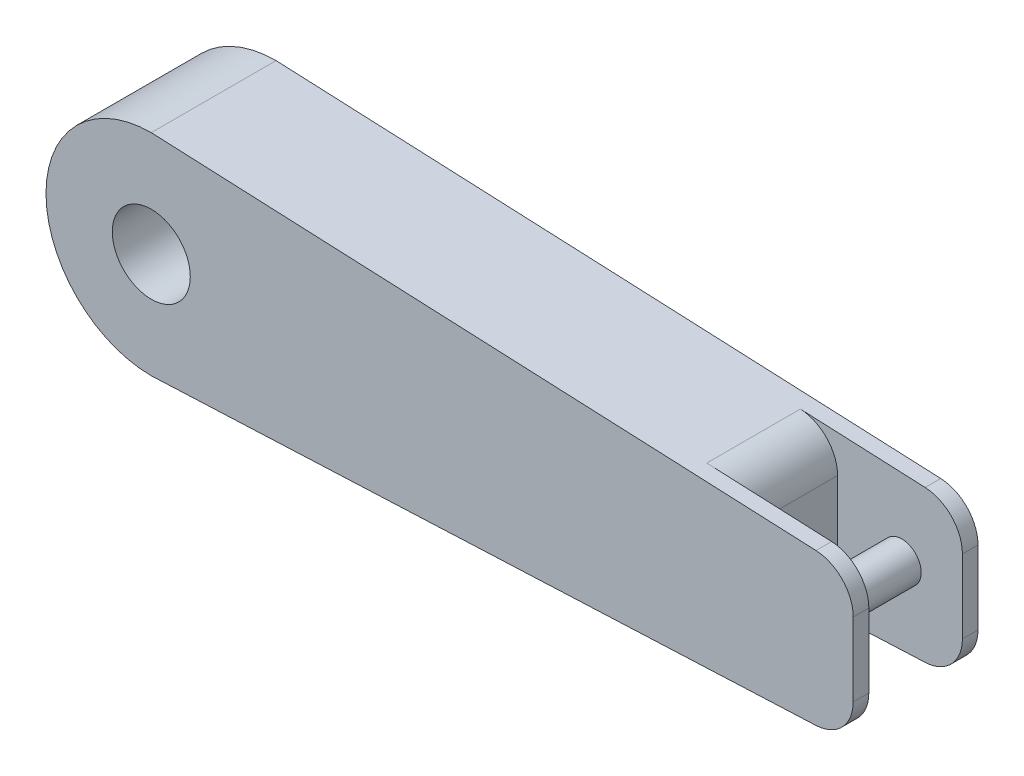
ISO-10303-21;
HEADER;
FILE_DESCRIPTION(('STEP AP214'),'2;1');
FILE_NAME('part.step','',(''),(''),'','','');
FILE_SCHEMA(('AUTOMOTIVE_DESIGN { 1 0 10303 214 1 1 1 1 }'));
ENDSEC;
DATA;
#1=APPLICATION_CONTEXT('core data for automotive mechanical design processes');
#2=APPLICATION_PROTOCOL_DEFINITION('international standard','automotive_design',2000,#1);
#3=PRODUCT_CONTEXT('',#1,'mechanical');
#4=PRODUCT('Part','Part','',(#3));
#5=PRODUCT_RELATED_PRODUCT_CATEGORY('part','',(#4));
#6=PRODUCT_DEFINITION_FORMATION('','',#4);
#7=PRODUCT_DEFINITION_CONTEXT('part definition',#1,'design');
#8=PRODUCT_DEFINITION('design','',#6,#7);
#9=PRODUCT_DEFINITION_SHAPE('','',#8);
#10=(LENGTH_UNIT() NAMED_UNIT(*) SI_UNIT(.MILLI.,.METRE.));
#11=(NAMED_UNIT(*) PLANE_ANGLE_UNIT() SI_UNIT($,.RADIAN.));
#12=(NAMED_UNIT(*) SI_UNIT($,.STERADIAN.) SOLID_ANGLE_UNIT());
#13=UNCERTAINTY_MEASURE_WITH_UNIT(LENGTH_MEASURE(1.E-05),#10,'distance_accuracy_value','');
#14=(GEOMETRIC_REPRESENTATION_CONTEXT(3) GLOBAL_UNCERTAINTY_ASSIGNED_CONTEXT((#13)) GLOBAL_UNIT_ASSIGNED_CONTEXT((#10,
#11,#12)) REPRESENTATION_CONTEXT('',''));
#15=CARTESIAN_POINT('',(0.,0.,0.));
#16=DIRECTION('',(0.,0.,1.));
#17=DIRECTION('',(1.,0.,0.));
#18=AXIS2_PLACEMENT_3D('',#15,#16,#17);
#19=CARTESIAN_POINT('',(298.400838847347,-67.5,80.));
#20=DIRECTION('',(-1.,0.,0.));
#21=DIRECTION('',(0.,0.,1.));
#22=AXIS2_PLACEMENT_3D('',#19,#20,#21);
#23=PLANE('',#22);
#24=DIRECTION('',(0.,1.,0.));
#25=VECTOR('',#24,1.);
#26=CARTESIAN_POINT('',(298.400838847347,-67.5,80.));
#27=LINE('',#26,#25);
#28=CARTESIAN_POINT('',(298.400838847347,-23.5864319343218,80.));
#29=VERTEX_POINT('',#28);
#30=CARTESIAN_POINT('',(298.400838847347,23.5864319343218,80.));
#31=VERTEX_POINT('',#30);
#32=EDGE_CURVE('E152',#29,#31,#27,.T.);
#33=ORIENTED_EDGE('',*,*,#32,.F.);
#34=DIRECTION('',(0.,0.,1.));
#35=VECTOR('',#34,1.);
#36=CARTESIAN_POINT('',(298.400838847347,-23.5864319343218,80.));
#37=LINE('',#36,#35);
#38=CARTESIAN_POINT('',(298.400838847347,-23.5864319343218,70.));
#39=VERTEX_POINT('',#38);
#40=EDGE_CURVE('E218',#29,#39,#37,.F.);
#41=ORIENTED_EDGE('',*,*,#40,.T.);
#42=DIRECTION('',(0.,-1.,0.));
#43=VECTOR('',#42,1.);
#44=CARTESIAN_POINT('',(298.400838847347,72.5000000000001,70.));
#45=LINE('',#44,#43);
#46=CARTESIAN_POINT('',(298.400838847347,23.5864319343218,70.));
#47=VERTEX_POINT('',#46);
#48=EDGE_CURVE('E288',#47,#39,#45,.T.);
#49=ORIENTED_EDGE('',*,*,#48,.F.);
#50=DIRECTION('',(0.,0.,1.));
#51=VECTOR('',#50,1.);
#52=CARTESIAN_POINT('',(298.400838847347,23.5864319343218,80.));
#53=LINE('',#52,#51);
#54=EDGE_CURVE('E215',#47,#31,#53,.T.);
#55=ORIENTED_EDGE('',*,*,#54,.T.);
#56=EDGE_LOOP('',(#33,#41,#49,#55));
#57=FACE_BOUND('',#56,.T.);
#58=ADVANCED_FACE('F39',(#57),#23,.F.);
#59=CARTESIAN_POINT('',(-151.599161152653,0.,80.));
#60=DIRECTION('',(0.,0.,1.));
#61=DIRECTION('',(1.,0.,0.));
#62=AXIS2_PLACEMENT_3D('',#59,#60,#61);
#63=PLANE('',#62);
#64=DIRECTION('',(-0.999013806466209,-0.0444006136207204,0.));
#65=VECTOR('',#64,1.);
#66=CARTESIAN_POINT('',(2.69522097357782,-60.6424719055009,80.));
#67=LINE('',#66,#65);
#68=CARTESIAN_POINT('',(274.510854187865,-48.561777095977,80.));
#69=VERTEX_POINT('',#68);
#70=CARTESIAN_POINT('',(-151.599161152653,-67.5,80.));
#71=VERTEX_POINT('',#70);
#72=EDGE_CURVE('E270',#69,#71,#67,.T.);
#73=ORIENTED_EDGE('',*,*,#72,.F.);
#74=CARTESIAN_POINT('',(273.400838847347,-23.5864319343218,80.));
#75=DIRECTION('',(0.,0.,1.));
#76=DIRECTION('',(1.,0.,0.));
#77=AXIS2_PLACEMENT_3D('',#74,#75,#76);
#78=CIRCLE('',#77,25.);
#79=EDGE_CURVE('E213',#69,#29,#78,.T.);
#80=ORIENTED_EDGE('',*,*,#79,.T.);
#81=ORIENTED_EDGE('',*,*,#32,.T.);
#82=CARTESIAN_POINT('',(273.400838847347,23.5864319343218,80.));
#83=DIRECTION('',(0.,0.,1.));
#84=DIRECTION('',(1.,0.,0.));
#85=AXIS2_PLACEMENT_3D('',#82,#83,#84);
#86=CIRCLE('',#85,25.);
#87=CARTESIAN_POINT('',(274.510854187865,48.561777095977,80.));
#88=VERTEX_POINT('',#87);
#89=EDGE_CURVE('E162',#31,#88,#86,.T.);
#90=ORIENTED_EDGE('',*,*,#89,.T.);
#91=DIRECTION('',(0.999013806466209,-0.0444006136207203,0.));
#92=VECTOR('',#91,1.);
#93=CARTESIAN_POINT('',(2.69522097357781,60.6424719055009,80.));
#94=LINE('',#93,#92);
#95=CARTESIAN_POINT('',(-151.599161152653,67.5,80.));
#96=VERTEX_POINT('',#95);
#97=EDGE_CURVE('E144',#96,#88,#94,.T.);
#98=ORIENTED_EDGE('',*,*,#97,.F.);
#99=CARTESIAN_POINT('',(-151.599161152653,0.,80.));
#100=DIRECTION('',(0.,0.,1.));
#101=DIRECTION('',(1.,0.,0.));
#102=AXIS2_PLACEMENT_3D('',#99,#100,#101);
#103=CIRCLE('',#102,67.5);
#104=EDGE_CURVE('E159',#96,#71,#103,.T.);
#105=ORIENTED_EDGE('',*,*,#104,.T.);
#106=EDGE_LOOP('',(#73,#80,#81,#90,#98,#105));
#107=FACE_BOUND('',#106,.T.);
#108=CARTESIAN_POINT('',(-151.599161152653,0.,80.));
#109=DIRECTION('',(0.,0.,1.));
#110=DIRECTION('',(1.,0.,0.));
#111=AXIS2_PLACEMENT_3D('',#108,#109,#110);
#112=CIRCLE('',#111,25.);
#113=CARTESIAN_POINT('',(-126.599161152653,0.,80.));
#114=VERTEX_POINT('',#113);
#115=EDGE_CURVE('E176',#114,#114,#112,.T.);
#116=ORIENTED_EDGE('',*,*,#115,.F.);
#117=EDGE_LOOP('',(#116));
#118=FACE_BOUND('',#117,.T.);
#119=ADVANCED_FACE('F157',(#107,#118),#63,.T.);
#120=CARTESIAN_POINT('',(-151.599161152653,0.,0.));
#121=DIRECTION('',(0.,0.,1.));
#122=DIRECTION('',(1.,0.,0.));
#123=AXIS2_PLACEMENT_3D('',#120,#121,#122);
#124=PLANE('',#123);
#125=DIRECTION('',(0.,1.,0.));
#126=VECTOR('',#125,1.);
#127=CARTESIAN_POINT('',(298.400838847347,-67.5,0.));
#128=LINE('',#127,#126);
#129=CARTESIAN_POINT('',(298.400838847347,-23.5864319343218,0.));
#130=VERTEX_POINT('',#129);
#131=CARTESIAN_POINT('',(298.400838847347,23.5864319343218,0.));
#132=VERTEX_POINT('',#131);
#133=EDGE_CURVE('E167',#130,#132,#128,.T.);
#134=ORIENTED_EDGE('',*,*,#133,.F.);
#135=CARTESIAN_POINT('',(273.400838847347,-23.5864319343218,0.));
#136=DIRECTION('',(0.,0.,1.));
#137=DIRECTION('',(1.,0.,0.));
#138=AXIS2_PLACEMENT_3D('',#135,#136,#137);
#139=CIRCLE('',#138,25.);
#140=CARTESIAN_POINT('',(274.510854187865,-48.561777095977,0.));
#141=VERTEX_POINT('',#140);
#142=EDGE_CURVE('E234',#130,#141,#139,.F.);
#143=ORIENTED_EDGE('',*,*,#142,.T.);
#144=DIRECTION('',(-0.999013806466209,-0.0444006136207204,0.));
#145=VECTOR('',#144,1.);
#146=CARTESIAN_POINT('',(2.69522097357782,-60.6424719055009,0.));
#147=LINE('',#146,#145);
#148=CARTESIAN_POINT('',(-151.599161152653,-67.5,0.));
#149=VERTEX_POINT('',#148);
#150=EDGE_CURVE('E163',#141,#149,#147,.T.);
#151=ORIENTED_EDGE('',*,*,#150,.T.);
#152=CARTESIAN_POINT('',(-151.599161152653,0.,0.));
#153=DIRECTION('',(0.,0.,1.));
#154=DIRECTION('',(1.,0.,0.));
#155=AXIS2_PLACEMENT_3D('',#152,#153,#154);
#156=CIRCLE('',#155,67.5);
#157=CARTESIAN_POINT('',(-151.599161152653,67.5,0.));
#158=VERTEX_POINT('',#157);
#159=EDGE_CURVE('E170',#158,#149,#156,.T.);
#160=ORIENTED_EDGE('',*,*,#159,.F.);
#161=DIRECTION('',(0.999013806466209,-0.0444006136207203,0.));
#162=VECTOR('',#161,1.);
#163=CARTESIAN_POINT('',(2.69522097357781,60.6424719055009,0.));
#164=LINE('',#163,#162);
#165=CARTESIAN_POINT('',(274.510854187865,48.561777095977,0.));
#166=VERTEX_POINT('',#165);
#167=EDGE_CURVE('E146',#158,#166,#164,.T.);
#168=ORIENTED_EDGE('',*,*,#167,.T.);
#169=CARTESIAN_POINT('',(273.400838847347,23.5864319343218,0.));
#170=DIRECTION('',(0.,0.,1.));
#171=DIRECTION('',(1.,0.,0.));
#172=AXIS2_PLACEMENT_3D('',#169,#170,#171);
#173=CIRCLE('',#172,25.);
#174=EDGE_CURVE('E61',#166,#132,#173,.F.);
#175=ORIENTED_EDGE('',*,*,#174,.T.);
#176=EDGE_LOOP('',(#134,#143,#151,#160,#168,#175));
#177=FACE_BOUND('',#176,.T.);
#178=CARTESIAN_POINT('',(-151.599161152653,0.,0.));
#179=DIRECTION('',(0.,0.,1.));
#180=DIRECTION('',(1.,0.,0.));
#181=AXIS2_PLACEMENT_3D('',#178,#179,#180);
#182=CIRCLE('',#181,25.);
#183=CARTESIAN_POINT('',(-126.599161152653,0.,0.));
#184=VERTEX_POINT('',#183);
#185=EDGE_CURVE('E173',#184,#184,#182,.T.);
#186=ORIENTED_EDGE('',*,*,#185,.T.);
#187=EDGE_LOOP('',(#186));
#188=FACE_BOUND('',#187,.T.);
#189=ADVANCED_FACE('F268',(#177,#188),#124,.F.);
#190=CARTESIAN_POINT('',(-151.599161152653,0.,80.));
#191=DIRECTION('',(0.,0.,-1.));
#192=DIRECTION('',(-1.,0.,0.));
#193=AXIS2_PLACEMENT_3D('',#190,#191,#192);
#194=CYLINDRICAL_SURFACE('',#193,67.5);
#195=ORIENTED_EDGE('',*,*,#159,.T.);
#196=DIRECTION('',(0.,0.,-1.));
#197=VECTOR('',#196,1.);
#198=CARTESIAN_POINT('',(-151.599161152653,-67.5,80.));
#199=LINE('',#198,#197);
#200=EDGE_CURVE('E151',#71,#149,#199,.T.);
#201=ORIENTED_EDGE('',*,*,#200,.F.);
#202=ORIENTED_EDGE('',*,*,#104,.F.);
#203=DIRECTION('',(0.,0.,-1.));
#204=VECTOR('',#203,1.);
#205=CARTESIAN_POINT('',(-151.599161152653,67.5,80.));
#206=LINE('',#205,#204);
#207=EDGE_CURVE('E141',#96,#158,#206,.T.);
#208=ORIENTED_EDGE('',*,*,#207,.T.);
#209=EDGE_LOOP('',(#195,#201,#202,#208));
#210=FACE_BOUND('',#209,.T.);
#211=ADVANCED_FACE('F165',(#210),#194,.T.);
#212=DIRECTION('',(0.,1.,0.));
#213=VECTOR('',#212,1.);
#214=CARTESIAN_POINT('',(298.400838847347,72.5000000000001,10.));
#215=LINE('',#214,#213);
#216=CARTESIAN_POINT('',(298.400838847347,-23.5864319343218,9.99999999999999));
#217=VERTEX_POINT('',#216);
#218=CARTESIAN_POINT('',(298.400838847347,23.5864319343218,9.99999999999999));
#219=VERTEX_POINT('',#218);
#220=EDGE_CURVE('E267',#217,#219,#215,.T.);
#221=ORIENTED_EDGE('',*,*,#220,.F.);
#222=DIRECTION('',(0.,0.,1.));
#223=VECTOR('',#222,1.);
#224=CARTESIAN_POINT('',(298.400838847347,-23.5864319343218,80.));
#225=LINE('',#224,#223);
#226=EDGE_CURVE('E231',#217,#130,#225,.F.);
#227=ORIENTED_EDGE('',*,*,#226,.T.);
#228=ORIENTED_EDGE('',*,*,#133,.T.);
#229=DIRECTION('',(0.,0.,1.));
#230=VECTOR('',#229,1.);
#231=CARTESIAN_POINT('',(298.400838847347,23.5864319343218,80.));
#232=LINE('',#231,#230);
#233=EDGE_CURVE('E228',#132,#219,#232,.T.);
#234=ORIENTED_EDGE('',*,*,#233,.T.);
#235=EDGE_LOOP('',(#221,#227,#228,#234));
#236=FACE_BOUND('',#235,.T.);
#237=ADVANCED_FACE('F265',(#236),#23,.F.);
#238=CARTESIAN_POINT('',(-151.599161152653,0.,80.));
#239=DIRECTION('',(0.,0.,-1.));
#240=DIRECTION('',(-1.,0.,0.));
#241=AXIS2_PLACEMENT_3D('',#238,#239,#240);
#242=CYLINDRICAL_SURFACE('',#241,25.);
#243=ORIENTED_EDGE('',*,*,#115,.T.);
#244=EDGE_LOOP('',(#243));
#245=FACE_BOUND('',#244,.T.);
#246=ORIENTED_EDGE('',*,*,#185,.F.);
#247=EDGE_LOOP('',(#246));
#248=FACE_BOUND('',#247,.T.);
#249=ADVANCED_FACE('F333',(#245,#248),#242,.F.);
#250=CARTESIAN_POINT('',(2.69522097357781,60.6424719055009,0.));
#251=DIRECTION('',(-0.0444006136207203,-0.999013806466209,0.));
#252=DIRECTION('',(0.999013806466209,-0.0444006136207203,0.));
#253=AXIS2_PLACEMENT_3D('',#250,#251,#252);
#254=PLANE('',#253);
#255=DIRECTION('',(0.999013806466209,-0.0444006136207203,0.));
#256=VECTOR('',#255,1.);
#257=CARTESIAN_POINT('',(2.69522097357781,60.6424719055009,10.));
#258=LINE('',#257,#256);
#259=CARTESIAN_POINT('',(194.510854187865,52.1173326515326,10.));
#260=VERTEX_POINT('',#259);
#261=CARTESIAN_POINT('',(274.510854187865,48.561777095977,10.));
#262=VERTEX_POINT('',#261);
#263=EDGE_CURVE('E275',#260,#262,#258,.T.);
#264=ORIENTED_EDGE('',*,*,#263,.T.);
#265=DIRECTION('',(0.,0.,1.));
#266=VECTOR('',#265,1.);
#267=CARTESIAN_POINT('',(274.510854187865,48.561777095977,0.));
#268=LINE('',#267,#266);
#269=EDGE_CURVE('E54',#262,#166,#268,.F.);
#270=ORIENTED_EDGE('',*,*,#269,.T.);
#271=ORIENTED_EDGE('',*,*,#167,.F.);
#272=ORIENTED_EDGE('',*,*,#207,.F.);
#273=ORIENTED_EDGE('',*,*,#97,.T.);
#274=DIRECTION('',(0.,0.,1.));
#275=VECTOR('',#274,1.);
#276=CARTESIAN_POINT('',(274.510854187865,48.561777095977,0.));
#277=LINE('',#276,#275);
#278=CARTESIAN_POINT('',(274.510854187865,48.561777095977,70.));
#279=VERTEX_POINT('',#278);
#280=EDGE_CURVE('E236',#88,#279,#277,.F.);
#281=ORIENTED_EDGE('',*,*,#280,.T.);
#282=DIRECTION('',(-0.999013806466209,0.0444006136207203,0.));
#283=VECTOR('',#282,1.);
#284=CARTESIAN_POINT('',(2.69522097357781,60.6424719055009,70.));
#285=LINE('',#284,#283);
#286=CARTESIAN_POINT('',(194.510854187865,52.1173326515326,70.));
#287=VERTEX_POINT('',#286);
#288=EDGE_CURVE('E273',#279,#287,#285,.T.);
#289=ORIENTED_EDGE('',*,*,#288,.T.);
#290=DIRECTION('',(0.,0.,1.));
#291=VECTOR('',#290,1.);
#292=CARTESIAN_POINT('',(194.510854187865,52.1173326515326,10.));
#293=LINE('',#292,#291);
#294=EDGE_CURVE('E193',#287,#260,#293,.F.);
#295=ORIENTED_EDGE('',*,*,#294,.T.);
#296=EDGE_LOOP('',(#264,#270,#271,#272,#273,#281,#289,#295));
#297=FACE_BOUND('',#296,.T.);
#298=ADVANCED_FACE('F143',(#297),#254,.F.);
#299=CARTESIAN_POINT('',(2.69522097357782,-60.6424719055009,0.));
#300=DIRECTION('',(-0.0444006136207204,0.999013806466209,0.));
#301=DIRECTION('',(-0.999013806466209,-0.0444006136207204,0.));
#302=AXIS2_PLACEMENT_3D('',#299,#300,#301);
#303=PLANE('',#302);
#304=DIRECTION('',(0.999013806466209,0.0444006136207204,0.));
#305=VECTOR('',#304,1.);
#306=CARTESIAN_POINT('',(2.69522097357782,-60.6424719055009,70.));
#307=LINE('',#306,#305);
#308=CARTESIAN_POINT('',(194.510854187865,-52.1173326515325,70.));
#309=VERTEX_POINT('',#308);
#310=CARTESIAN_POINT('',(274.510854187865,-48.561777095977,70.));
#311=VERTEX_POINT('',#310);
#312=EDGE_CURVE('E181',#309,#311,#307,.T.);
#313=ORIENTED_EDGE('',*,*,#312,.T.);
#314=DIRECTION('',(0.,0.,1.));
#315=VECTOR('',#314,1.);
#316=CARTESIAN_POINT('',(274.510854187865,-48.561777095977,0.));
#317=LINE('',#316,#315);
#318=EDGE_CURVE('E209',#311,#69,#317,.T.);
#319=ORIENTED_EDGE('',*,*,#318,.T.);
#320=ORIENTED_EDGE('',*,*,#72,.T.);
#321=ORIENTED_EDGE('',*,*,#200,.T.);
#322=ORIENTED_EDGE('',*,*,#150,.F.);
#323=DIRECTION('',(0.,0.,1.));
#324=VECTOR('',#323,1.);
#325=CARTESIAN_POINT('',(274.510854187865,-48.561777095977,0.));
#326=LINE('',#325,#324);
#327=CARTESIAN_POINT('',(274.510854187865,-48.561777095977,9.99999999999998));
#328=VERTEX_POINT('',#327);
#329=EDGE_CURVE('E206',#141,#328,#326,.T.);
#330=ORIENTED_EDGE('',*,*,#329,.T.);
#331=DIRECTION('',(-0.999013806466209,-0.0444006136207204,0.));
#332=VECTOR('',#331,1.);
#333=CARTESIAN_POINT('',(2.69522097357782,-60.6424719055009,9.99999999999998));
#334=LINE('',#333,#332);
#335=CARTESIAN_POINT('',(194.510854187865,-52.1173326515325,9.99999999999998));
#336=VERTEX_POINT('',#335);
#337=EDGE_CURVE('E179',#328,#336,#334,.T.);
#338=ORIENTED_EDGE('',*,*,#337,.T.);
#339=DIRECTION('',(0.,0.,-1.));
#340=VECTOR('',#339,1.);
#341=CARTESIAN_POINT('',(194.510854187865,-52.1173326515325,70.));
#342=LINE('',#341,#340);
#343=EDGE_CURVE('E190',#336,#309,#342,.F.);
#344=ORIENTED_EDGE('',*,*,#343,.T.);
#345=EDGE_LOOP('',(#313,#319,#320,#321,#322,#330,#338,#344));
#346=FACE_BOUND('',#345,.T.);
#347=ADVANCED_FACE('F256',(#346),#303,.F.);
#348=CARTESIAN_POINT('',(218.400838847347,72.5000000000001,70.));
#349=DIRECTION('',(0.,0.,1.));
#350=DIRECTION('',(0.,-1.,0.));
#351=AXIS2_PLACEMENT_3D('',#348,#349,#350);
#352=PLANE('',#351);
#353=CARTESIAN_POINT('',(259.510854187865,0.,70.));
#354=DIRECTION('',(0.,0.,1.));
#355=DIRECTION('',(0.,-1.,0.));
#356=AXIS2_PLACEMENT_3D('',#353,#354,#355);
#357=CIRCLE('',#356,12.5);
#358=CARTESIAN_POINT('',(259.510854187865,-12.5,70.));
#359=VERTEX_POINT('',#358);
#360=EDGE_CURVE('E11',#359,#359,#357,.F.);
#361=ORIENTED_EDGE('',*,*,#360,.F.);
#362=EDGE_LOOP('',(#361));
#363=FACE_BOUND('',#362,.T.);
#364=ORIENTED_EDGE('',*,*,#48,.T.);
#365=CARTESIAN_POINT('',(273.400838847347,-23.5864319343218,70.));
#366=DIRECTION('',(0.,0.,1.));
#367=DIRECTION('',(0.,-1.,0.));
#368=AXIS2_PLACEMENT_3D('',#365,#366,#367);
#369=CIRCLE('',#368,25.);
#370=EDGE_CURVE('E222',#39,#311,#369,.F.);
#371=ORIENTED_EDGE('',*,*,#370,.T.);
#372=ORIENTED_EDGE('',*,*,#312,.F.);
#373=CARTESIAN_POINT('',(193.400838847347,-27.1419874898773,70.));
#374=DIRECTION('',(0.,0.,1.));
#375=DIRECTION('',(0.,-1.,0.));
#376=AXIS2_PLACEMENT_3D('',#373,#374,#375);
#377=CIRCLE('',#376,25.);
#378=CARTESIAN_POINT('',(218.400838847347,-27.1419874898773,70.));
#379=VERTEX_POINT('',#378);
#380=EDGE_CURVE('E199',#309,#379,#377,.T.);
#381=ORIENTED_EDGE('',*,*,#380,.T.);
#382=DIRECTION('',(0.,-1.,0.));
#383=VECTOR('',#382,1.);
#384=CARTESIAN_POINT('',(218.400838847347,72.5000000000001,70.));
#385=LINE('',#384,#383);
#386=CARTESIAN_POINT('',(218.400838847347,27.1419874898774,70.));
#387=VERTEX_POINT('',#386);
#388=EDGE_CURVE('E287',#387,#379,#385,.T.);
#389=ORIENTED_EDGE('',*,*,#388,.F.);
#390=CARTESIAN_POINT('',(193.400838847347,27.1419874898774,70.));
#391=DIRECTION('',(0.,0.,1.));
#392=DIRECTION('',(0.,-1.,0.));
#393=AXIS2_PLACEMENT_3D('',#390,#391,#392);
#394=CIRCLE('',#393,25.);
#395=EDGE_CURVE('E201',#387,#287,#394,.T.);
#396=ORIENTED_EDGE('',*,*,#395,.T.);
#397=ORIENTED_EDGE('',*,*,#288,.F.);
#398=CARTESIAN_POINT('',(273.400838847347,23.5864319343218,70.));
#399=DIRECTION('',(0.,0.,1.));
#400=DIRECTION('',(0.,-1.,0.));
#401=AXIS2_PLACEMENT_3D('',#398,#399,#400);
#402=CIRCLE('',#401,25.);
#403=EDGE_CURVE('E220',#279,#47,#402,.F.);
#404=ORIENTED_EDGE('',*,*,#403,.T.);
#405=EDGE_LOOP('',(#364,#371,#372,#381,#389,#396,#397,#404));
#406=FACE_BOUND('',#405,.T.);
#407=ADVANCED_FACE('F248',(#363,#406),#352,.F.);
#408=CARTESIAN_POINT('',(218.400838847347,72.5000000000001,10.));
#409=DIRECTION('',(0.,0.,-1.));
#410=DIRECTION('',(0.,1.,0.));
#411=AXIS2_PLACEMENT_3D('',#408,#409,#410);
#412=PLANE('',#411);
#413=CARTESIAN_POINT('',(259.510854187865,0.,9.99999999999998));
#414=DIRECTION('',(0.,0.,-1.));
#415=DIRECTION('',(0.,1.,0.));
#416=AXIS2_PLACEMENT_3D('',#413,#414,#415);
#417=CIRCLE('',#416,12.5);
#418=CARTESIAN_POINT('',(259.510854187865,12.5,9.99999999999998));
#419=VERTEX_POINT('',#418);
#420=EDGE_CURVE('E47',#419,#419,#417,.F.);
#421=ORIENTED_EDGE('',*,*,#420,.F.);
#422=EDGE_LOOP('',(#421));
#423=FACE_BOUND('',#422,.T.);
#424=ORIENTED_EDGE('',*,*,#337,.F.);
#425=CARTESIAN_POINT('',(273.400838847347,-23.5864319343218,9.99999999999999));
#426=DIRECTION('',(0.,0.,-1.));
#427=DIRECTION('',(0.,1.,0.));
#428=AXIS2_PLACEMENT_3D('',#425,#426,#427);
#429=CIRCLE('',#428,25.);
#430=EDGE_CURVE('E226',#328,#217,#429,.F.);
#431=ORIENTED_EDGE('',*,*,#430,.T.);
#432=ORIENTED_EDGE('',*,*,#220,.T.);
#433=CARTESIAN_POINT('',(273.400838847347,23.5864319343218,9.99999999999998));
#434=DIRECTION('',(0.,0.,-1.));
#435=DIRECTION('',(0.,1.,0.));
#436=AXIS2_PLACEMENT_3D('',#433,#434,#435);
#437=CIRCLE('',#436,25.);
#438=EDGE_CURVE('E224',#219,#262,#437,.F.);
#439=ORIENTED_EDGE('',*,*,#438,.T.);
#440=ORIENTED_EDGE('',*,*,#263,.F.);
#441=CARTESIAN_POINT('',(193.400838847347,27.1419874898774,9.99999999999999));
#442=DIRECTION('',(0.,0.,-1.));
#443=DIRECTION('',(0.,1.,0.));
#444=AXIS2_PLACEMENT_3D('',#441,#442,#443);
#445=CIRCLE('',#444,25.);
#446=CARTESIAN_POINT('',(218.400838847347,27.1419874898774,9.99999999999999));
#447=VERTEX_POINT('',#446);
#448=EDGE_CURVE('E204',#260,#447,#445,.T.);
#449=ORIENTED_EDGE('',*,*,#448,.T.);
#450=DIRECTION('',(0.,1.,0.));
#451=VECTOR('',#450,1.);
#452=CARTESIAN_POINT('',(218.400838847347,72.5000000000001,10.));
#453=LINE('',#452,#451);
#454=CARTESIAN_POINT('',(218.400838847347,-27.1419874898773,9.99999999999999));
#455=VERTEX_POINT('',#454);
#456=EDGE_CURVE('E285',#455,#447,#453,.T.);
#457=ORIENTED_EDGE('',*,*,#456,.F.);
#458=CARTESIAN_POINT('',(193.400838847347,-27.1419874898773,9.99999999999999));
#459=DIRECTION('',(0.,0.,-1.));
#460=DIRECTION('',(0.,1.,0.));
#461=AXIS2_PLACEMENT_3D('',#458,#459,#460);
#462=CIRCLE('',#461,25.);
#463=EDGE_CURVE('E196',#455,#336,#462,.T.);
#464=ORIENTED_EDGE('',*,*,#463,.T.);
#465=EDGE_LOOP('',(#424,#431,#432,#439,#440,#449,#457,#464));
#466=FACE_BOUND('',#465,.T.);
#467=ADVANCED_FACE('F244',(#423,#466),#412,.F.);
#468=CARTESIAN_POINT('',(218.400838847347,0.,0.));
#469=DIRECTION('',(1.,0.,0.));
#470=DIRECTION('',(0.,0.,-1.));
#471=AXIS2_PLACEMENT_3D('',#468,#469,#470);
#472=PLANE('',#471);
#473=ORIENTED_EDGE('',*,*,#388,.T.);
#474=DIRECTION('',(0.,0.,-1.));
#475=VECTOR('',#474,1.);
#476=CARTESIAN_POINT('',(218.400838847347,-27.1419874898773,9.99999999999998));
#477=LINE('',#476,#475);
#478=EDGE_CURVE('E187',#379,#455,#477,.T.);
#479=ORIENTED_EDGE('',*,*,#478,.T.);
#480=ORIENTED_EDGE('',*,*,#456,.T.);
#481=DIRECTION('',(0.,0.,1.));
#482=VECTOR('',#481,1.);
#483=CARTESIAN_POINT('',(218.400838847347,27.1419874898774,70.));
#484=LINE('',#483,#482);
#485=EDGE_CURVE('E184',#447,#387,#484,.T.);
#486=ORIENTED_EDGE('',*,*,#485,.T.);
#487=EDGE_LOOP('',(#473,#479,#480,#486));
#488=FACE_BOUND('',#487,.T.);
#489=ADVANCED_FACE('F247',(#488),#472,.T.);
#490=CARTESIAN_POINT('',(193.400838847347,-27.1419874898773,0.));
#491=DIRECTION('',(0.,0.,1.));
#492=DIRECTION('',(1.,0.,0.));
#493=AXIS2_PLACEMENT_3D('',#490,#491,#492);
#494=CYLINDRICAL_SURFACE('',#493,25.);
#495=ORIENTED_EDGE('',*,*,#380,.F.);
#496=ORIENTED_EDGE('',*,*,#343,.F.);
#497=ORIENTED_EDGE('',*,*,#463,.F.);
#498=ORIENTED_EDGE('',*,*,#478,.F.);
#499=EDGE_LOOP('',(#495,#496,#497,#498));
#500=FACE_BOUND('',#499,.T.);
#501=ADVANCED_FACE('F300',(#500),#494,.T.);
#502=CARTESIAN_POINT('',(193.400838847347,27.1419874898774,0.));
#503=DIRECTION('',(0.,0.,-1.));
#504=DIRECTION('',(-1.,0.,0.));
#505=AXIS2_PLACEMENT_3D('',#502,#503,#504);
#506=CYLINDRICAL_SURFACE('',#505,25.);
#507=ORIENTED_EDGE('',*,*,#448,.F.);
#508=ORIENTED_EDGE('',*,*,#294,.F.);
#509=ORIENTED_EDGE('',*,*,#395,.F.);
#510=ORIENTED_EDGE('',*,*,#485,.F.);
#511=EDGE_LOOP('',(#507,#508,#509,#510));
#512=FACE_BOUND('',#511,.T.);
#513=ADVANCED_FACE('F315',(#512),#506,.T.);
#514=CARTESIAN_POINT('',(273.400838847347,-23.5864319343218,0.));
#515=DIRECTION('',(0.,0.,1.));
#516=DIRECTION('',(1.,0.,0.));
#517=AXIS2_PLACEMENT_3D('',#514,#515,#516);
#518=CYLINDRICAL_SURFACE('',#517,25.);
#519=ORIENTED_EDGE('',*,*,#370,.F.);
#520=ORIENTED_EDGE('',*,*,#40,.F.);
#521=ORIENTED_EDGE('',*,*,#79,.F.);
#522=ORIENTED_EDGE('',*,*,#318,.F.);
#523=EDGE_LOOP('',(#519,#520,#521,#522));
#524=FACE_BOUND('',#523,.T.);
#525=ADVANCED_FACE('F303',(#524),#518,.T.);
#526=CARTESIAN_POINT('',(273.400838847347,-23.5864319343218,0.));
#527=DIRECTION('',(0.,0.,1.));
#528=DIRECTION('',(1.,0.,0.));
#529=AXIS2_PLACEMENT_3D('',#526,#527,#528);
#530=CYLINDRICAL_SURFACE('',#529,25.);
#531=ORIENTED_EDGE('',*,*,#142,.F.);
#532=ORIENTED_EDGE('',*,*,#226,.F.);
#533=ORIENTED_EDGE('',*,*,#430,.F.);
#534=ORIENTED_EDGE('',*,*,#329,.F.);
#535=EDGE_LOOP('',(#531,#532,#533,#534));
#536=FACE_BOUND('',#535,.T.);
#537=ADVANCED_FACE('F262',(#536),#530,.T.);
#538=CARTESIAN_POINT('',(273.400838847347,23.5864319343218,80.));
#539=DIRECTION('',(0.,0.,1.));
#540=DIRECTION('',(1.,0.,0.));
#541=AXIS2_PLACEMENT_3D('',#538,#539,#540);
#542=CYLINDRICAL_SURFACE('',#541,25.);
#543=ORIENTED_EDGE('',*,*,#174,.F.);
#544=ORIENTED_EDGE('',*,*,#269,.F.);
#545=ORIENTED_EDGE('',*,*,#438,.F.);
#546=ORIENTED_EDGE('',*,*,#233,.F.);
#547=EDGE_LOOP('',(#543,#544,#545,#546));
#548=FACE_BOUND('',#547,.T.);
#549=ADVANCED_FACE('F317',(#548),#542,.T.);
#550=CARTESIAN_POINT('',(273.400838847347,23.5864319343218,80.));
#551=DIRECTION('',(0.,0.,1.));
#552=DIRECTION('',(1.,0.,0.));
#553=AXIS2_PLACEMENT_3D('',#550,#551,#552);
#554=CYLINDRICAL_SURFACE('',#553,25.);
#555=ORIENTED_EDGE('',*,*,#403,.F.);
#556=ORIENTED_EDGE('',*,*,#280,.F.);
#557=ORIENTED_EDGE('',*,*,#89,.F.);
#558=ORIENTED_EDGE('',*,*,#54,.F.);
#559=EDGE_LOOP('',(#555,#556,#557,#558));
#560=FACE_BOUND('',#559,.T.);
#561=ADVANCED_FACE('F41',(#560),#554,.T.);
#562=CARTESIAN_POINT('',(259.510854187865,0.,105.355339059327));
#563=DIRECTION('',(0.,0.,-1.));
#564=DIRECTION('',(-1.,0.,0.));
#565=AXIS2_PLACEMENT_3D('',#562,#563,#564);
#566=CYLINDRICAL_SURFACE('',#565,12.5);
#567=ORIENTED_EDGE('',*,*,#420,.T.);
#568=EDGE_LOOP('',(#567));
#569=FACE_BOUND('',#568,.T.);
#570=ORIENTED_EDGE('',*,*,#360,.T.);
#571=EDGE_LOOP('',(#570));
#572=FACE_BOUND('',#571,.T.);
#573=ADVANCED_FACE('F241',(#569,#572),#566,.T.);
#574=CLOSED_SHELL('',(#58,#119,#189,#211,#237,#249,#298,#347,#407,#467,#489,#501,#513,#525,#537,
#549,#561,#573));
#575=MANIFOLD_SOLID_BREP('B2',#574);
#576=ADVANCED_BREP_SHAPE_REPRESENTATION('',(#18,#575),#14);
#577=SHAPE_DEFINITION_REPRESENTATION(#9,#576);
ENDSEC;
END-ISO-10303-21;
